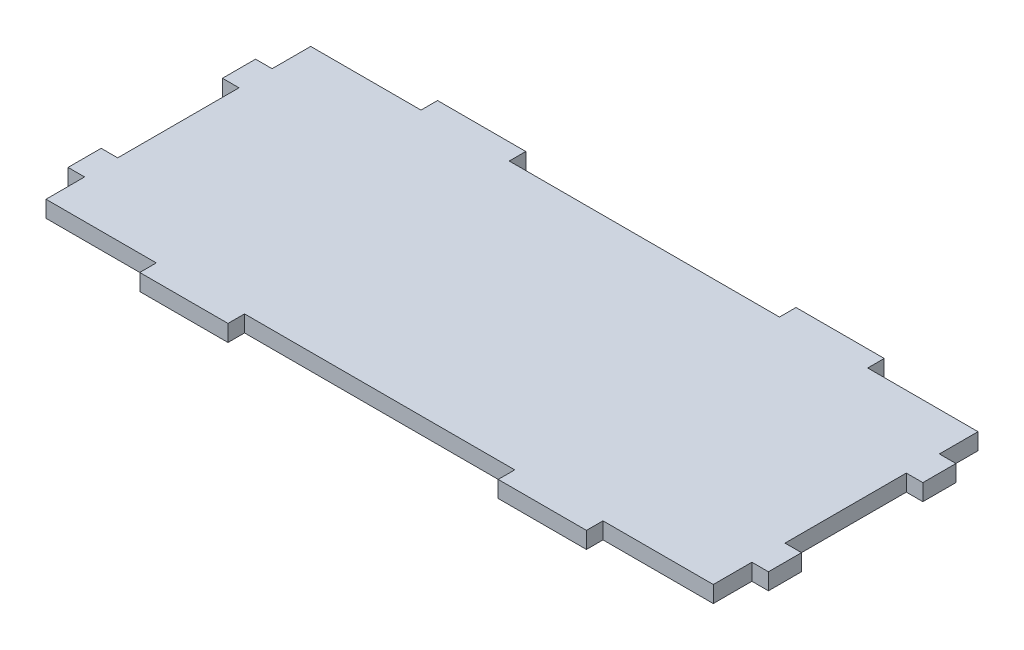
ISO-10303-21;
HEADER;
FILE_DESCRIPTION(('STEP AP214'),'2;1');
FILE_NAME('part.step','',(''),(''),'','','');
FILE_SCHEMA(('AUTOMOTIVE_DESIGN { 1 0 10303 214 1 1 1 1 }'));
ENDSEC;
DATA;
#1=APPLICATION_CONTEXT('core data for automotive mechanical design processes');
#2=APPLICATION_PROTOCOL_DEFINITION('international standard','automotive_design',2000,#1);
#3=PRODUCT_CONTEXT('',#1,'mechanical');
#4=PRODUCT('Part','Part','',(#3));
#5=PRODUCT_RELATED_PRODUCT_CATEGORY('part','',(#4));
#6=PRODUCT_DEFINITION_FORMATION('','',#4);
#7=PRODUCT_DEFINITION_CONTEXT('part definition',#1,'design');
#8=PRODUCT_DEFINITION('design','',#6,#7);
#9=PRODUCT_DEFINITION_SHAPE('','',#8);
#10=(LENGTH_UNIT() NAMED_UNIT(*) SI_UNIT(.MILLI.,.METRE.));
#11=(NAMED_UNIT(*) PLANE_ANGLE_UNIT() SI_UNIT($,.RADIAN.));
#12=(NAMED_UNIT(*) SI_UNIT($,.STERADIAN.) SOLID_ANGLE_UNIT());
#13=UNCERTAINTY_MEASURE_WITH_UNIT(LENGTH_MEASURE(1.E-05),#10,'distance_accuracy_value','');
#14=(GEOMETRIC_REPRESENTATION_CONTEXT(3) GLOBAL_UNCERTAINTY_ASSIGNED_CONTEXT((#13)) GLOBAL_UNIT_ASSIGNED_CONTEXT((#10,
#11,#12)) REPRESENTATION_CONTEXT('',''));
#15=CARTESIAN_POINT('',(0.,0.,0.));
#16=DIRECTION('',(0.,0.,1.));
#17=DIRECTION('',(1.,0.,0.));
#18=AXIS2_PLACEMENT_3D('',#15,#16,#17);
#19=CARTESIAN_POINT('',(85.,3.,0.));
#20=DIRECTION('',(1.,0.,0.));
#21=DIRECTION('',(0.,0.,-1.));
#22=AXIS2_PLACEMENT_3D('',#19,#20,#21);
#23=PLANE('',#22);
#24=DIRECTION('',(0.,0.,1.));
#25=VECTOR('',#24,1.);
#26=CARTESIAN_POINT('',(85.,0.,0.));
#27=LINE('',#26,#25);
#28=CARTESIAN_POINT('',(85.,0.,0.));
#29=VERTEX_POINT('',#28);
#30=CARTESIAN_POINT('',(85.,0.,3.));
#31=VERTEX_POINT('',#30);
#32=EDGE_CURVE('E465',#29,#31,#27,.T.);
#33=ORIENTED_EDGE('',*,*,#32,.T.);
#34=DIRECTION('',(0.,-1.,0.));
#35=VECTOR('',#34,1.);
#36=CARTESIAN_POINT('',(85.,3.,3.));
#37=LINE('',#36,#35);
#38=CARTESIAN_POINT('',(85.,3.,3.));
#39=VERTEX_POINT('',#38);
#40=EDGE_CURVE('E595',#39,#31,#37,.T.);
#41=ORIENTED_EDGE('',*,*,#40,.F.);
#42=DIRECTION('',(0.,0.,1.));
#43=VECTOR('',#42,1.);
#44=CARTESIAN_POINT('',(85.,3.,0.));
#45=LINE('',#44,#43);
#46=CARTESIAN_POINT('',(85.,3.,0.));
#47=VERTEX_POINT('',#46);
#48=EDGE_CURVE('E812',#47,#39,#45,.T.);
#49=ORIENTED_EDGE('',*,*,#48,.F.);
#50=DIRECTION('',(0.,-1.,0.));
#51=VECTOR('',#50,1.);
#52=CARTESIAN_POINT('',(85.,3.,0.));
#53=LINE('',#52,#51);
#54=EDGE_CURVE('E598',#47,#29,#53,.T.);
#55=ORIENTED_EDGE('',*,*,#54,.T.);
#56=EDGE_LOOP('',(#33,#41,#49,#55));
#57=FACE_BOUND('',#56,.T.);
#58=ADVANCED_FACE('F290',(#57),#23,.F.);
#59=CARTESIAN_POINT('',(0.,3.,3.00000000000001));
#60=DIRECTION('',(0.,0.,1.));
#61=DIRECTION('',(1.,0.,0.));
#62=AXIS2_PLACEMENT_3D('',#59,#60,#61);
#63=PLANE('',#62);
#64=DIRECTION('',(-1.,0.,0.));
#65=VECTOR('',#64,1.);
#66=CARTESIAN_POINT('',(0.,0.,3.00000000000001));
#67=LINE('',#66,#65);
#68=CARTESIAN_POINT('',(101.,0.,3.));
#69=VERTEX_POINT('',#68);
#70=EDGE_CURVE('E470',#69,#31,#67,.T.);
#71=ORIENTED_EDGE('',*,*,#70,.F.);
#72=DIRECTION('',(0.,-1.,0.));
#73=VECTOR('',#72,1.);
#74=CARTESIAN_POINT('',(101.,3.,3.));
#75=LINE('',#74,#73);
#76=CARTESIAN_POINT('',(101.,3.,3.));
#77=VERTEX_POINT('',#76);
#78=EDGE_CURVE('E592',#77,#69,#75,.T.);
#79=ORIENTED_EDGE('',*,*,#78,.F.);
#80=DIRECTION('',(-1.,0.,0.));
#81=VECTOR('',#80,1.);
#82=CARTESIAN_POINT('',(0.,3.,3.00000000000001));
#83=LINE('',#82,#81);
#84=EDGE_CURVE('E816',#77,#39,#83,.T.);
#85=ORIENTED_EDGE('',*,*,#84,.T.);
#86=ORIENTED_EDGE('',*,*,#40,.T.);
#87=EDGE_LOOP('',(#71,#79,#85,#86));
#88=FACE_BOUND('',#87,.T.);
#89=ADVANCED_FACE('F901',(#88),#63,.T.);
#90=CARTESIAN_POINT('',(101.,3.,0.));
#91=DIRECTION('',(1.,0.,0.));
#92=DIRECTION('',(0.,0.,-1.));
#93=AXIS2_PLACEMENT_3D('',#90,#91,#92);
#94=PLANE('',#93);
#95=DIRECTION('',(0.,0.,1.));
#96=VECTOR('',#95,1.);
#97=CARTESIAN_POINT('',(101.,0.,0.));
#98=LINE('',#97,#96);
#99=CARTESIAN_POINT('',(101.,0.,0.));
#100=VERTEX_POINT('',#99);
#101=EDGE_CURVE('E473',#100,#69,#98,.T.);
#102=ORIENTED_EDGE('',*,*,#101,.F.);
#103=DIRECTION('',(0.,-1.,0.));
#104=VECTOR('',#103,1.);
#105=CARTESIAN_POINT('',(101.,3.,0.));
#106=LINE('',#105,#104);
#107=CARTESIAN_POINT('',(101.,3.,0.));
#108=VERTEX_POINT('',#107);
#109=EDGE_CURVE('E589',#108,#100,#106,.T.);
#110=ORIENTED_EDGE('',*,*,#109,.F.);
#111=DIRECTION('',(0.,0.,1.));
#112=VECTOR('',#111,1.);
#113=CARTESIAN_POINT('',(101.,3.,0.));
#114=LINE('',#113,#112);
#115=EDGE_CURVE('E876',#108,#77,#114,.T.);
#116=ORIENTED_EDGE('',*,*,#115,.T.);
#117=ORIENTED_EDGE('',*,*,#78,.T.);
#118=EDGE_LOOP('',(#102,#110,#116,#117));
#119=FACE_BOUND('',#118,.T.);
#120=ADVANCED_FACE('F906',(#119),#94,.T.);
#121=CARTESIAN_POINT('',(0.,3.,0.));
#122=DIRECTION('',(0.,0.,-1.));
#123=DIRECTION('',(-1.,0.,0.));
#124=AXIS2_PLACEMENT_3D('',#121,#122,#123);
#125=PLANE('',#124);
#126=DIRECTION('',(1.,0.,0.));
#127=VECTOR('',#126,1.);
#128=CARTESIAN_POINT('',(0.,0.,0.));
#129=LINE('',#128,#127);
#130=CARTESIAN_POINT('',(121.,0.,0.));
#131=VERTEX_POINT('',#130);
#132=EDGE_CURVE('E476',#100,#131,#129,.T.);
#133=ORIENTED_EDGE('',*,*,#132,.T.);
#134=DIRECTION('',(0.,-1.,0.));
#135=VECTOR('',#134,1.);
#136=CARTESIAN_POINT('',(121.,3.,0.));
#137=LINE('',#136,#135);
#138=CARTESIAN_POINT('',(121.,3.,0.));
#139=VERTEX_POINT('',#138);
#140=EDGE_CURVE('E586',#139,#131,#137,.T.);
#141=ORIENTED_EDGE('',*,*,#140,.F.);
#142=DIRECTION('',(1.,0.,0.));
#143=VECTOR('',#142,1.);
#144=CARTESIAN_POINT('',(0.,3.,0.));
#145=LINE('',#144,#143);
#146=EDGE_CURVE('E879',#108,#139,#145,.T.);
#147=ORIENTED_EDGE('',*,*,#146,.F.);
#148=ORIENTED_EDGE('',*,*,#109,.T.);
#149=EDGE_LOOP('',(#133,#141,#147,#148));
#150=FACE_BOUND('',#149,.T.);
#151=ADVANCED_FACE('F1197',(#150),#125,.F.);
#152=CARTESIAN_POINT('',(121.,3.,0.));
#153=DIRECTION('',(-1.,0.,0.));
#154=DIRECTION('',(0.,0.,1.));
#155=AXIS2_PLACEMENT_3D('',#152,#153,#154);
#156=PLANE('',#155);
#157=DIRECTION('',(0.,0.,-1.));
#158=VECTOR('',#157,1.);
#159=CARTESIAN_POINT('',(121.,0.,0.));
#160=LINE('',#159,#158);
#161=CARTESIAN_POINT('',(121.,0.,-7.00000000000002));
#162=VERTEX_POINT('',#161);
#163=EDGE_CURVE('E479',#131,#162,#160,.T.);
#164=ORIENTED_EDGE('',*,*,#163,.T.);
#165=DIRECTION('',(0.,-1.,0.));
#166=VECTOR('',#165,1.);
#167=CARTESIAN_POINT('',(121.,3.,-7.00000000000002));
#168=LINE('',#167,#166);
#169=CARTESIAN_POINT('',(121.,3.,-7.00000000000002));
#170=VERTEX_POINT('',#169);
#171=EDGE_CURVE('E583',#170,#162,#168,.T.);
#172=ORIENTED_EDGE('',*,*,#171,.F.);
#173=DIRECTION('',(0.,0.,-1.));
#174=VECTOR('',#173,1.);
#175=CARTESIAN_POINT('',(121.,3.,0.));
#176=LINE('',#175,#174);
#177=EDGE_CURVE('E705',#139,#170,#176,.T.);
#178=ORIENTED_EDGE('',*,*,#177,.F.);
#179=ORIENTED_EDGE('',*,*,#140,.T.);
#180=EDGE_LOOP('',(#164,#172,#178,#179));
#181=FACE_BOUND('',#180,.T.);
#182=ADVANCED_FACE('F898',(#181),#156,.F.);
#183=CARTESIAN_POINT('',(0.,3.,-6.99999999999998));
#184=DIRECTION('',(0.,0.,-1.));
#185=DIRECTION('',(-1.,0.,0.));
#186=AXIS2_PLACEMENT_3D('',#183,#184,#185);
#187=PLANE('',#186);
#188=DIRECTION('',(1.,0.,0.));
#189=VECTOR('',#188,1.);
#190=CARTESIAN_POINT('',(0.,0.,-6.99999999999998));
#191=LINE('',#190,#189);
#192=CARTESIAN_POINT('',(124.,0.,-7.00000000000002));
#193=VERTEX_POINT('',#192);
#194=EDGE_CURVE('E482',#162,#193,#191,.T.);
#195=ORIENTED_EDGE('',*,*,#194,.T.);
#196=DIRECTION('',(0.,-1.,0.));
#197=VECTOR('',#196,1.);
#198=CARTESIAN_POINT('',(124.,3.,-7.00000000000002));
#199=LINE('',#198,#197);
#200=CARTESIAN_POINT('',(124.,3.,-7.00000000000002));
#201=VERTEX_POINT('',#200);
#202=EDGE_CURVE('E580',#201,#193,#199,.T.);
#203=ORIENTED_EDGE('',*,*,#202,.F.);
#204=DIRECTION('',(1.,0.,0.));
#205=VECTOR('',#204,1.);
#206=CARTESIAN_POINT('',(0.,3.,-6.99999999999998));
#207=LINE('',#206,#205);
#208=EDGE_CURVE('E881',#170,#201,#207,.T.);
#209=ORIENTED_EDGE('',*,*,#208,.F.);
#210=ORIENTED_EDGE('',*,*,#171,.T.);
#211=EDGE_LOOP('',(#195,#203,#209,#210));
#212=FACE_BOUND('',#211,.T.);
#213=ADVANCED_FACE('F1178',(#212),#187,.F.);
#214=CARTESIAN_POINT('',(124.,3.,0.));
#215=DIRECTION('',(1.,0.,0.));
#216=DIRECTION('',(0.,0.,-1.));
#217=AXIS2_PLACEMENT_3D('',#214,#215,#216);
#218=PLANE('',#217);
#219=DIRECTION('',(0.,0.,1.));
#220=VECTOR('',#219,1.);
#221=CARTESIAN_POINT('',(124.,0.,0.));
#222=LINE('',#221,#220);
#223=CARTESIAN_POINT('',(124.,0.,-13.));
#224=VERTEX_POINT('',#223);
#225=EDGE_CURVE('E487',#224,#193,#222,.T.);
#226=ORIENTED_EDGE('',*,*,#225,.F.);
#227=DIRECTION('',(0.,-1.,0.));
#228=VECTOR('',#227,1.);
#229=CARTESIAN_POINT('',(124.,3.,-13.));
#230=LINE('',#229,#228);
#231=CARTESIAN_POINT('',(124.,3.,-13.));
#232=VERTEX_POINT('',#231);
#233=EDGE_CURVE('E577',#232,#224,#230,.T.);
#234=ORIENTED_EDGE('',*,*,#233,.F.);
#235=DIRECTION('',(0.,0.,1.));
#236=VECTOR('',#235,1.);
#237=CARTESIAN_POINT('',(124.,3.,0.));
#238=LINE('',#237,#236);
#239=EDGE_CURVE('E883',#232,#201,#238,.T.);
#240=ORIENTED_EDGE('',*,*,#239,.T.);
#241=ORIENTED_EDGE('',*,*,#202,.T.);
#242=EDGE_LOOP('',(#226,#234,#240,#241));
#243=FACE_BOUND('',#242,.T.);
#244=ADVANCED_FACE('F1167',(#243),#218,.T.);
#245=CARTESIAN_POINT('',(0.,3.,-13.));
#246=DIRECTION('',(0.,0.,-1.));
#247=DIRECTION('',(-1.,0.,0.));
#248=AXIS2_PLACEMENT_3D('',#245,#246,#247);
#249=PLANE('',#248);
#250=DIRECTION('',(1.,0.,0.));
#251=VECTOR('',#250,1.);
#252=CARTESIAN_POINT('',(0.,0.,-13.));
#253=LINE('',#252,#251);
#254=CARTESIAN_POINT('',(121.,0.,-13.));
#255=VERTEX_POINT('',#254);
#256=EDGE_CURVE('E490',#255,#224,#253,.T.);
#257=ORIENTED_EDGE('',*,*,#256,.F.);
#258=DIRECTION('',(0.,-1.,0.));
#259=VECTOR('',#258,1.);
#260=CARTESIAN_POINT('',(121.,3.,-13.));
#261=LINE('',#260,#259);
#262=CARTESIAN_POINT('',(121.,3.,-13.));
#263=VERTEX_POINT('',#262);
#264=EDGE_CURVE('E574',#263,#255,#261,.T.);
#265=ORIENTED_EDGE('',*,*,#264,.F.);
#266=DIRECTION('',(1.,0.,0.));
#267=VECTOR('',#266,1.);
#268=CARTESIAN_POINT('',(0.,3.,-13.));
#269=LINE('',#268,#267);
#270=EDGE_CURVE('E886',#263,#232,#269,.T.);
#271=ORIENTED_EDGE('',*,*,#270,.T.);
#272=ORIENTED_EDGE('',*,*,#233,.T.);
#273=EDGE_LOOP('',(#257,#265,#271,#272));
#274=FACE_BOUND('',#273,.T.);
#275=ADVANCED_FACE('F1158',(#274),#249,.T.);
#276=CARTESIAN_POINT('',(121.,0.,-35.));
#277=VERTEX_POINT('',#276);
#278=EDGE_CURVE('E484',#255,#277,#160,.T.);
#279=ORIENTED_EDGE('',*,*,#278,.T.);
#280=DIRECTION('',(0.,-1.,0.));
#281=VECTOR('',#280,1.);
#282=CARTESIAN_POINT('',(121.,3.,-35.));
#283=LINE('',#282,#281);
#284=CARTESIAN_POINT('',(121.,3.,-35.));
#285=VERTEX_POINT('',#284);
#286=EDGE_CURVE('E571',#285,#277,#283,.T.);
#287=ORIENTED_EDGE('',*,*,#286,.F.);
#288=EDGE_CURVE('E704',#263,#285,#176,.T.);
#289=ORIENTED_EDGE('',*,*,#288,.F.);
#290=ORIENTED_EDGE('',*,*,#264,.T.);
#291=EDGE_LOOP('',(#279,#287,#289,#290));
#292=FACE_BOUND('',#291,.T.);
#293=ADVANCED_FACE('F716',(#292),#156,.F.);
#294=CARTESIAN_POINT('',(0.,3.,-35.));
#295=DIRECTION('',(0.,0.,-1.));
#296=DIRECTION('',(-1.,0.,0.));
#297=AXIS2_PLACEMENT_3D('',#294,#295,#296);
#298=PLANE('',#297);
#299=DIRECTION('',(1.,0.,0.));
#300=VECTOR('',#299,1.);
#301=CARTESIAN_POINT('',(0.,0.,-35.));
#302=LINE('',#301,#300);
#303=CARTESIAN_POINT('',(124.,0.,-35.));
#304=VERTEX_POINT('',#303);
#305=EDGE_CURVE('E493',#277,#304,#302,.T.);
#306=ORIENTED_EDGE('',*,*,#305,.T.);
#307=DIRECTION('',(0.,-1.,0.));
#308=VECTOR('',#307,1.);
#309=CARTESIAN_POINT('',(124.,3.,-35.));
#310=LINE('',#309,#308);
#311=CARTESIAN_POINT('',(124.,3.,-35.));
#312=VERTEX_POINT('',#311);
#313=EDGE_CURVE('E568',#312,#304,#310,.T.);
#314=ORIENTED_EDGE('',*,*,#313,.F.);
#315=DIRECTION('',(1.,0.,0.));
#316=VECTOR('',#315,1.);
#317=CARTESIAN_POINT('',(0.,3.,-35.));
#318=LINE('',#317,#316);
#319=EDGE_CURVE('E730',#285,#312,#318,.T.);
#320=ORIENTED_EDGE('',*,*,#319,.F.);
#321=ORIENTED_EDGE('',*,*,#286,.T.);
#322=EDGE_LOOP('',(#306,#314,#320,#321));
#323=FACE_BOUND('',#322,.T.);
#324=ADVANCED_FACE('F727',(#323),#298,.F.);
#325=CARTESIAN_POINT('',(124.,3.,0.));
#326=DIRECTION('',(1.,0.,0.));
#327=DIRECTION('',(0.,0.,-1.));
#328=AXIS2_PLACEMENT_3D('',#325,#326,#327);
#329=PLANE('',#328);
#330=DIRECTION('',(0.,0.,1.));
#331=VECTOR('',#330,1.);
#332=CARTESIAN_POINT('',(124.,0.,0.));
#333=LINE('',#332,#331);
#334=CARTESIAN_POINT('',(124.,0.,-41.));
#335=VERTEX_POINT('',#334);
#336=EDGE_CURVE('E496',#335,#304,#333,.T.);
#337=ORIENTED_EDGE('',*,*,#336,.F.);
#338=DIRECTION('',(0.,-1.,0.));
#339=VECTOR('',#338,1.);
#340=CARTESIAN_POINT('',(124.,3.,-41.));
#341=LINE('',#340,#339);
#342=CARTESIAN_POINT('',(124.,3.,-41.));
#343=VERTEX_POINT('',#342);
#344=EDGE_CURVE('E565',#343,#335,#341,.T.);
#345=ORIENTED_EDGE('',*,*,#344,.F.);
#346=DIRECTION('',(0.,0.,1.));
#347=VECTOR('',#346,1.);
#348=CARTESIAN_POINT('',(124.,3.,0.));
#349=LINE('',#348,#347);
#350=EDGE_CURVE('E889',#343,#312,#349,.T.);
#351=ORIENTED_EDGE('',*,*,#350,.T.);
#352=ORIENTED_EDGE('',*,*,#313,.T.);
#353=EDGE_LOOP('',(#337,#345,#351,#352));
#354=FACE_BOUND('',#353,.T.);
#355=ADVANCED_FACE('F736',(#354),#329,.T.);
#356=CARTESIAN_POINT('',(0.,3.,-41.));
#357=DIRECTION('',(0.,0.,-1.));
#358=DIRECTION('',(-1.,0.,0.));
#359=AXIS2_PLACEMENT_3D('',#356,#357,#358);
#360=PLANE('',#359);
#361=DIRECTION('',(1.,0.,0.));
#362=VECTOR('',#361,1.);
#363=CARTESIAN_POINT('',(0.,0.,-41.));
#364=LINE('',#363,#362);
#365=CARTESIAN_POINT('',(121.,0.,-41.));
#366=VERTEX_POINT('',#365);
#367=EDGE_CURVE('E499',#366,#335,#364,.T.);
#368=ORIENTED_EDGE('',*,*,#367,.F.);
#369=DIRECTION('',(0.,-1.,0.));
#370=VECTOR('',#369,1.);
#371=CARTESIAN_POINT('',(121.,3.,-41.));
#372=LINE('',#371,#370);
#373=CARTESIAN_POINT('',(121.,3.,-41.));
#374=VERTEX_POINT('',#373);
#375=EDGE_CURVE('E562',#374,#366,#372,.T.);
#376=ORIENTED_EDGE('',*,*,#375,.F.);
#377=DIRECTION('',(1.,0.,0.));
#378=VECTOR('',#377,1.);
#379=CARTESIAN_POINT('',(0.,3.,-41.));
#380=LINE('',#379,#378);
#381=EDGE_CURVE('E436',#374,#343,#380,.T.);
#382=ORIENTED_EDGE('',*,*,#381,.T.);
#383=ORIENTED_EDGE('',*,*,#344,.T.);
#384=EDGE_LOOP('',(#368,#376,#382,#383));
#385=FACE_BOUND('',#384,.T.);
#386=ADVANCED_FACE('F890',(#385),#360,.T.);
#387=CARTESIAN_POINT('',(121.,0.,-48.));
#388=VERTEX_POINT('',#387);
#389=EDGE_CURVE('E483',#366,#388,#160,.T.);
#390=ORIENTED_EDGE('',*,*,#389,.T.);
#391=DIRECTION('',(0.,-1.,0.));
#392=VECTOR('',#391,1.);
#393=CARTESIAN_POINT('',(121.,3.,-48.));
#394=LINE('',#393,#392);
#395=CARTESIAN_POINT('',(121.,3.,-48.));
#396=VERTEX_POINT('',#395);
#397=EDGE_CURVE('E559',#396,#388,#394,.T.);
#398=ORIENTED_EDGE('',*,*,#397,.F.);
#399=EDGE_CURVE('E433',#374,#396,#176,.T.);
#400=ORIENTED_EDGE('',*,*,#399,.F.);
#401=ORIENTED_EDGE('',*,*,#375,.T.);
#402=EDGE_LOOP('',(#390,#398,#400,#401));
#403=FACE_BOUND('',#402,.T.);
#404=ADVANCED_FACE('F707',(#403),#156,.F.);
#405=CARTESIAN_POINT('',(0.,3.,-48.));
#406=DIRECTION('',(0.,0.,-1.));
#407=DIRECTION('',(-1.,0.,0.));
#408=AXIS2_PLACEMENT_3D('',#405,#406,#407);
#409=PLANE('',#408);
#410=DIRECTION('',(0.,-1.,0.));
#411=VECTOR('',#410,1.);
#412=CARTESIAN_POINT('',(101.,3.,-48.));
#413=LINE('',#412,#411);
#414=CARTESIAN_POINT('',(101.,3.,-48.));
#415=VERTEX_POINT('',#414);
#416=CARTESIAN_POINT('',(101.,0.,-48.));
#417=VERTEX_POINT('',#416);
#418=EDGE_CURVE('E294',#415,#417,#413,.T.);
#419=ORIENTED_EDGE('',*,*,#418,.F.);
#420=DIRECTION('',(1.,0.,0.));
#421=VECTOR('',#420,1.);
#422=CARTESIAN_POINT('',(0.,3.,-48.));
#423=LINE('',#422,#421);
#424=EDGE_CURVE('E428',#415,#396,#423,.T.);
#425=ORIENTED_EDGE('',*,*,#424,.T.);
#426=ORIENTED_EDGE('',*,*,#397,.T.);
#427=DIRECTION('',(1.,0.,0.));
#428=VECTOR('',#427,1.);
#429=CARTESIAN_POINT('',(0.,0.,-48.));
#430=LINE('',#429,#428);
#431=EDGE_CURVE('E506',#417,#388,#430,.T.);
#432=ORIENTED_EDGE('',*,*,#431,.F.);
#433=EDGE_LOOP('',(#419,#425,#426,#432));
#434=FACE_BOUND('',#433,.T.);
#435=ADVANCED_FACE('F691',(#434),#409,.T.);
#436=DIRECTION('',(0.,-1.,0.));
#437=VECTOR('',#436,1.);
#438=CARTESIAN_POINT('',(36.,3.,-48.));
#439=LINE('',#438,#437);
#440=CARTESIAN_POINT('',(36.,3.,-48.));
#441=VERTEX_POINT('',#440);
#442=CARTESIAN_POINT('',(36.,0.,-48.));
#443=VERTEX_POINT('',#442);
#444=EDGE_CURVE('E12',#441,#443,#439,.T.);
#445=ORIENTED_EDGE('',*,*,#444,.F.);
#446=CARTESIAN_POINT('',(85.,3.,-48.));
#447=VERTEX_POINT('',#446);
#448=EDGE_CURVE('E420',#441,#447,#423,.T.);
#449=ORIENTED_EDGE('',*,*,#448,.T.);
#450=DIRECTION('',(0.,-1.,0.));
#451=VECTOR('',#450,1.);
#452=CARTESIAN_POINT('',(85.,3.,-48.));
#453=LINE('',#452,#451);
#454=CARTESIAN_POINT('',(85.,0.,-48.));
#455=VERTEX_POINT('',#454);
#456=EDGE_CURVE('E385',#447,#455,#453,.T.);
#457=ORIENTED_EDGE('',*,*,#456,.T.);
#458=EDGE_CURVE('E376',#443,#455,#430,.T.);
#459=ORIENTED_EDGE('',*,*,#458,.F.);
#460=EDGE_LOOP('',(#445,#449,#457,#459));
#461=FACE_BOUND('',#460,.T.);
#462=ADVANCED_FACE('F425',(#461),#409,.T.);
#463=CARTESIAN_POINT('',(0.,3.,-48.));
#464=VERTEX_POINT('',#463);
#465=CARTESIAN_POINT('',(20.,3.,-48.));
#466=VERTEX_POINT('',#465);
#467=EDGE_CURVE('E427',#464,#466,#423,.T.);
#468=ORIENTED_EDGE('',*,*,#467,.T.);
#469=DIRECTION('',(0.,-1.,0.));
#470=VECTOR('',#469,1.);
#471=CARTESIAN_POINT('',(20.,3.,-48.));
#472=LINE('',#471,#470);
#473=CARTESIAN_POINT('',(20.,0.,-48.));
#474=VERTEX_POINT('',#473);
#475=EDGE_CURVE('E300',#466,#474,#472,.T.);
#476=ORIENTED_EDGE('',*,*,#475,.T.);
#477=CARTESIAN_POINT('',(0.,0.,-48.));
#478=VERTEX_POINT('',#477);
#479=EDGE_CURVE('E502',#478,#474,#430,.T.);
#480=ORIENTED_EDGE('',*,*,#479,.F.);
#481=DIRECTION('',(0.,-1.,0.));
#482=VECTOR('',#481,1.);
#483=CARTESIAN_POINT('',(0.,3.,-48.));
#484=LINE('',#483,#482);
#485=EDGE_CURVE('E556',#464,#478,#484,.T.);
#486=ORIENTED_EDGE('',*,*,#485,.F.);
#487=EDGE_LOOP('',(#468,#476,#480,#486));
#488=FACE_BOUND('',#487,.T.);
#489=ADVANCED_FACE('F641',(#488),#409,.T.);
#490=CARTESIAN_POINT('',(0.,3.,0.));
#491=DIRECTION('',(-1.,0.,0.));
#492=DIRECTION('',(0.,0.,1.));
#493=AXIS2_PLACEMENT_3D('',#490,#491,#492);
#494=PLANE('',#493);
#495=DIRECTION('',(0.,-1.,0.));
#496=VECTOR('',#495,1.);
#497=CARTESIAN_POINT('',(0.,3.,-41.));
#498=LINE('',#497,#496);
#499=CARTESIAN_POINT('',(0.,3.,-41.));
#500=VERTEX_POINT('',#499);
#501=CARTESIAN_POINT('',(0.,0.,-41.));
#502=VERTEX_POINT('',#501);
#503=EDGE_CURVE('E309',#500,#502,#498,.T.);
#504=ORIENTED_EDGE('',*,*,#503,.F.);
#505=DIRECTION('',(0.,0.,-1.));
#506=VECTOR('',#505,1.);
#507=CARTESIAN_POINT('',(0.,3.,0.));
#508=LINE('',#507,#506);
#509=EDGE_CURVE('E431',#500,#464,#508,.T.);
#510=ORIENTED_EDGE('',*,*,#509,.T.);
#511=ORIENTED_EDGE('',*,*,#485,.T.);
#512=DIRECTION('',(0.,0.,-1.));
#513=VECTOR('',#512,1.);
#514=CARTESIAN_POINT('',(0.,0.,0.));
#515=LINE('',#514,#513);
#516=EDGE_CURVE('E505',#502,#478,#515,.T.);
#517=ORIENTED_EDGE('',*,*,#516,.F.);
#518=EDGE_LOOP('',(#504,#510,#511,#517));
#519=FACE_BOUND('',#518,.T.);
#520=ADVANCED_FACE('F648',(#519),#494,.T.);
#521=CARTESIAN_POINT('',(0.,3.,-13.));
#522=VERTEX_POINT('',#521);
#523=CARTESIAN_POINT('',(0.,3.,-35.));
#524=VERTEX_POINT('',#523);
#525=EDGE_CURVE('E438',#522,#524,#508,.T.);
#526=ORIENTED_EDGE('',*,*,#525,.T.);
#527=DIRECTION('',(0.,-1.,0.));
#528=VECTOR('',#527,1.);
#529=CARTESIAN_POINT('',(0.,3.,-35.));
#530=LINE('',#529,#528);
#531=CARTESIAN_POINT('',(0.,0.,-35.));
#532=VERTEX_POINT('',#531);
#533=EDGE_CURVE('E601',#524,#532,#530,.T.);
#534=ORIENTED_EDGE('',*,*,#533,.T.);
#535=CARTESIAN_POINT('',(0.,0.,-13.));
#536=VERTEX_POINT('',#535);
#537=EDGE_CURVE('E507',#536,#532,#515,.T.);
#538=ORIENTED_EDGE('',*,*,#537,.F.);
#539=DIRECTION('',(0.,-1.,0.));
#540=VECTOR('',#539,1.);
#541=CARTESIAN_POINT('',(0.,3.,-13.));
#542=LINE('',#541,#540);
#543=EDGE_CURVE('E553',#522,#536,#542,.T.);
#544=ORIENTED_EDGE('',*,*,#543,.F.);
#545=EDGE_LOOP('',(#526,#534,#538,#544));
#546=FACE_BOUND('',#545,.T.);
#547=ADVANCED_FACE('F861',(#546),#494,.T.);
#548=CARTESIAN_POINT('',(0.,3.,-13.));
#549=DIRECTION('',(0.,0.,1.));
#550=DIRECTION('',(1.,0.,0.));
#551=AXIS2_PLACEMENT_3D('',#548,#549,#550);
#552=PLANE('',#551);
#553=DIRECTION('',(-1.,0.,0.));
#554=VECTOR('',#553,1.);
#555=CARTESIAN_POINT('',(0.,0.,-13.));
#556=LINE('',#555,#554);
#557=CARTESIAN_POINT('',(-3.,0.,-13.));
#558=VERTEX_POINT('',#557);
#559=EDGE_CURVE('E510',#536,#558,#556,.T.);
#560=ORIENTED_EDGE('',*,*,#559,.T.);
#561=DIRECTION('',(0.,-1.,0.));
#562=VECTOR('',#561,1.);
#563=CARTESIAN_POINT('',(-3.,3.,-13.));
#564=LINE('',#563,#562);
#565=CARTESIAN_POINT('',(-3.,3.,-13.));
#566=VERTEX_POINT('',#565);
#567=EDGE_CURVE('E550',#566,#558,#564,.T.);
#568=ORIENTED_EDGE('',*,*,#567,.F.);
#569=DIRECTION('',(-1.,0.,0.));
#570=VECTOR('',#569,1.);
#571=CARTESIAN_POINT('',(0.,3.,-13.));
#572=LINE('',#571,#570);
#573=EDGE_CURVE('E441',#522,#566,#572,.T.);
#574=ORIENTED_EDGE('',*,*,#573,.F.);
#575=ORIENTED_EDGE('',*,*,#543,.T.);
#576=EDGE_LOOP('',(#560,#568,#574,#575));
#577=FACE_BOUND('',#576,.T.);
#578=ADVANCED_FACE('F1069',(#577),#552,.F.);
#579=CARTESIAN_POINT('',(-3.,3.,0.));
#580=DIRECTION('',(1.,0.,0.));
#581=DIRECTION('',(0.,0.,-1.));
#582=AXIS2_PLACEMENT_3D('',#579,#580,#581);
#583=PLANE('',#582);
#584=DIRECTION('',(0.,0.,1.));
#585=VECTOR('',#584,1.);
#586=CARTESIAN_POINT('',(-3.,0.,0.));
#587=LINE('',#586,#585);
#588=CARTESIAN_POINT('',(-3.,0.,-7.));
#589=VERTEX_POINT('',#588);
#590=EDGE_CURVE('E514',#558,#589,#587,.T.);
#591=ORIENTED_EDGE('',*,*,#590,.T.);
#592=DIRECTION('',(0.,-1.,0.));
#593=VECTOR('',#592,1.);
#594=CARTESIAN_POINT('',(-3.,3.,-7.));
#595=LINE('',#594,#593);
#596=CARTESIAN_POINT('',(-3.,3.,-7.));
#597=VERTEX_POINT('',#596);
#598=EDGE_CURVE('E547',#597,#589,#595,.T.);
#599=ORIENTED_EDGE('',*,*,#598,.F.);
#600=DIRECTION('',(0.,0.,1.));
#601=VECTOR('',#600,1.);
#602=CARTESIAN_POINT('',(-3.,3.,0.));
#603=LINE('',#602,#601);
#604=EDGE_CURVE('E445',#566,#597,#603,.T.);
#605=ORIENTED_EDGE('',*,*,#604,.F.);
#606=ORIENTED_EDGE('',*,*,#567,.T.);
#607=EDGE_LOOP('',(#591,#599,#605,#606));
#608=FACE_BOUND('',#607,.T.);
#609=ADVANCED_FACE('F855',(#608),#583,.F.);
#610=CARTESIAN_POINT('',(0.,3.,-7.));
#611=DIRECTION('',(0.,0.,1.));
#612=DIRECTION('',(1.,0.,0.));
#613=AXIS2_PLACEMENT_3D('',#610,#611,#612);
#614=PLANE('',#613);
#615=DIRECTION('',(-1.,0.,0.));
#616=VECTOR('',#615,1.);
#617=CARTESIAN_POINT('',(0.,0.,-7.));
#618=LINE('',#617,#616);
#619=CARTESIAN_POINT('',(0.,0.,-7.));
#620=VERTEX_POINT('',#619);
#621=EDGE_CURVE('E517',#620,#589,#618,.T.);
#622=ORIENTED_EDGE('',*,*,#621,.F.);
#623=DIRECTION('',(0.,-1.,0.));
#624=VECTOR('',#623,1.);
#625=CARTESIAN_POINT('',(0.,3.,-7.));
#626=LINE('',#625,#624);
#627=CARTESIAN_POINT('',(0.,3.,-7.));
#628=VERTEX_POINT('',#627);
#629=EDGE_CURVE('E544',#628,#620,#626,.T.);
#630=ORIENTED_EDGE('',*,*,#629,.F.);
#631=DIRECTION('',(-1.,0.,0.));
#632=VECTOR('',#631,1.);
#633=CARTESIAN_POINT('',(0.,3.,-7.));
#634=LINE('',#633,#632);
#635=EDGE_CURVE('E448',#628,#597,#634,.T.);
#636=ORIENTED_EDGE('',*,*,#635,.T.);
#637=ORIENTED_EDGE('',*,*,#598,.T.);
#638=EDGE_LOOP('',(#622,#630,#636,#637));
#639=FACE_BOUND('',#638,.T.);
#640=ADVANCED_FACE('F851',(#639),#614,.T.);
#641=CARTESIAN_POINT('',(0.,0.,0.));
#642=VERTEX_POINT('',#641);
#643=EDGE_CURVE('E511',#642,#620,#515,.T.);
#644=ORIENTED_EDGE('',*,*,#643,.F.);
#645=DIRECTION('',(0.,-1.,0.));
#646=VECTOR('',#645,1.);
#647=CARTESIAN_POINT('',(0.,3.,0.));
#648=LINE('',#647,#646);
#649=CARTESIAN_POINT('',(0.,3.,0.));
#650=VERTEX_POINT('',#649);
#651=EDGE_CURVE('E541',#650,#642,#648,.T.);
#652=ORIENTED_EDGE('',*,*,#651,.F.);
#653=EDGE_CURVE('E442',#650,#628,#508,.T.);
#654=ORIENTED_EDGE('',*,*,#653,.T.);
#655=ORIENTED_EDGE('',*,*,#629,.T.);
#656=EDGE_LOOP('',(#644,#652,#654,#655));
#657=FACE_BOUND('',#656,.T.);
#658=ADVANCED_FACE('F847',(#657),#494,.T.);
#659=CARTESIAN_POINT('',(0.,3.,0.));
#660=DIRECTION('',(0.,0.,-1.));
#661=DIRECTION('',(-1.,0.,0.));
#662=AXIS2_PLACEMENT_3D('',#659,#660,#661);
#663=PLANE('',#662);
#664=DIRECTION('',(1.,0.,0.));
#665=VECTOR('',#664,1.);
#666=CARTESIAN_POINT('',(0.,0.,0.));
#667=LINE('',#666,#665);
#668=CARTESIAN_POINT('',(20.,0.,0.));
#669=VERTEX_POINT('',#668);
#670=EDGE_CURVE('E467',#642,#669,#667,.T.);
#671=ORIENTED_EDGE('',*,*,#670,.T.);
#672=DIRECTION('',(0.,-1.,0.));
#673=VECTOR('',#672,1.);
#674=CARTESIAN_POINT('',(20.,3.,0.));
#675=LINE('',#674,#673);
#676=CARTESIAN_POINT('',(20.,3.,0.));
#677=VERTEX_POINT('',#676);
#678=EDGE_CURVE('E538',#677,#669,#675,.T.);
#679=ORIENTED_EDGE('',*,*,#678,.F.);
#680=DIRECTION('',(1.,0.,0.));
#681=VECTOR('',#680,1.);
#682=CARTESIAN_POINT('',(0.,3.,0.));
#683=LINE('',#682,#681);
#684=EDGE_CURVE('E455',#650,#677,#683,.T.);
#685=ORIENTED_EDGE('',*,*,#684,.F.);
#686=ORIENTED_EDGE('',*,*,#651,.T.);
#687=EDGE_LOOP('',(#671,#679,#685,#686));
#688=FACE_BOUND('',#687,.T.);
#689=ADVANCED_FACE('F842',(#688),#663,.F.);
#690=CARTESIAN_POINT('',(20.,3.,0.));
#691=DIRECTION('',(1.,0.,0.));
#692=DIRECTION('',(0.,0.,-1.));
#693=AXIS2_PLACEMENT_3D('',#690,#691,#692);
#694=PLANE('',#693);
#695=DIRECTION('',(0.,0.,1.));
#696=VECTOR('',#695,1.);
#697=CARTESIAN_POINT('',(20.,0.,0.));
#698=LINE('',#697,#696);
#699=CARTESIAN_POINT('',(20.,0.,3.));
#700=VERTEX_POINT('',#699);
#701=EDGE_CURVE('E520',#669,#700,#698,.T.);
#702=ORIENTED_EDGE('',*,*,#701,.T.);
#703=DIRECTION('',(0.,-1.,0.));
#704=VECTOR('',#703,1.);
#705=CARTESIAN_POINT('',(20.,3.,3.));
#706=LINE('',#705,#704);
#707=CARTESIAN_POINT('',(20.,3.,3.));
#708=VERTEX_POINT('',#707);
#709=EDGE_CURVE('E535',#708,#700,#706,.T.);
#710=ORIENTED_EDGE('',*,*,#709,.F.);
#711=DIRECTION('',(0.,0.,1.));
#712=VECTOR('',#711,1.);
#713=CARTESIAN_POINT('',(20.,3.,0.));
#714=LINE('',#713,#712);
#715=EDGE_CURVE('E451',#677,#708,#714,.T.);
#716=ORIENTED_EDGE('',*,*,#715,.F.);
#717=ORIENTED_EDGE('',*,*,#678,.T.);
#718=EDGE_LOOP('',(#702,#710,#716,#717));
#719=FACE_BOUND('',#718,.T.);
#720=ADVANCED_FACE('F837',(#719),#694,.F.);
#721=CARTESIAN_POINT('',(0.,3.,3.));
#722=DIRECTION('',(0.,0.,-1.));
#723=DIRECTION('',(-1.,0.,0.));
#724=AXIS2_PLACEMENT_3D('',#721,#722,#723);
#725=PLANE('',#724);
#726=DIRECTION('',(1.,0.,0.));
#727=VECTOR('',#726,1.);
#728=CARTESIAN_POINT('',(0.,0.,3.));
#729=LINE('',#728,#727);
#730=CARTESIAN_POINT('',(36.,0.,3.));
#731=VERTEX_POINT('',#730);
#732=EDGE_CURVE('E523',#700,#731,#729,.T.);
#733=ORIENTED_EDGE('',*,*,#732,.T.);
#734=DIRECTION('',(0.,-1.,0.));
#735=VECTOR('',#734,1.);
#736=CARTESIAN_POINT('',(36.,3.,3.));
#737=LINE('',#736,#735);
#738=CARTESIAN_POINT('',(36.,3.,3.));
#739=VERTEX_POINT('',#738);
#740=EDGE_CURVE('E532',#739,#731,#737,.T.);
#741=ORIENTED_EDGE('',*,*,#740,.F.);
#742=DIRECTION('',(1.,0.,0.));
#743=VECTOR('',#742,1.);
#744=CARTESIAN_POINT('',(0.,3.,3.));
#745=LINE('',#744,#743);
#746=EDGE_CURVE('E454',#708,#739,#745,.T.);
#747=ORIENTED_EDGE('',*,*,#746,.F.);
#748=ORIENTED_EDGE('',*,*,#709,.T.);
#749=EDGE_LOOP('',(#733,#741,#747,#748));
#750=FACE_BOUND('',#749,.T.);
#751=ADVANCED_FACE('F830',(#750),#725,.F.);
#752=CARTESIAN_POINT('',(36.,3.,0.));
#753=DIRECTION('',(1.,0.,0.));
#754=DIRECTION('',(0.,0.,-1.));
#755=AXIS2_PLACEMENT_3D('',#752,#753,#754);
#756=PLANE('',#755);
#757=DIRECTION('',(0.,0.,1.));
#758=VECTOR('',#757,1.);
#759=CARTESIAN_POINT('',(36.,0.,0.));
#760=LINE('',#759,#758);
#761=CARTESIAN_POINT('',(36.,0.,0.));
#762=VERTEX_POINT('',#761);
#763=EDGE_CURVE('E526',#762,#731,#760,.T.);
#764=ORIENTED_EDGE('',*,*,#763,.F.);
#765=DIRECTION('',(0.,-1.,0.));
#766=VECTOR('',#765,1.);
#767=CARTESIAN_POINT('',(36.,3.,0.));
#768=LINE('',#767,#766);
#769=CARTESIAN_POINT('',(36.,3.,0.));
#770=VERTEX_POINT('',#769);
#771=EDGE_CURVE('E461',#770,#762,#768,.T.);
#772=ORIENTED_EDGE('',*,*,#771,.F.);
#773=DIRECTION('',(0.,0.,1.));
#774=VECTOR('',#773,1.);
#775=CARTESIAN_POINT('',(36.,3.,0.));
#776=LINE('',#775,#774);
#777=EDGE_CURVE('E458',#770,#739,#776,.T.);
#778=ORIENTED_EDGE('',*,*,#777,.T.);
#779=ORIENTED_EDGE('',*,*,#740,.T.);
#780=EDGE_LOOP('',(#764,#772,#778,#779));
#781=FACE_BOUND('',#780,.T.);
#782=ADVANCED_FACE('F826',(#781),#756,.T.);
#783=EDGE_CURVE('E462',#762,#29,#667,.T.);
#784=ORIENTED_EDGE('',*,*,#783,.T.);
#785=ORIENTED_EDGE('',*,*,#54,.F.);
#786=EDGE_CURVE('E529',#770,#47,#683,.T.);
#787=ORIENTED_EDGE('',*,*,#786,.F.);
#788=ORIENTED_EDGE('',*,*,#771,.T.);
#789=EDGE_LOOP('',(#784,#785,#787,#788));
#790=FACE_BOUND('',#789,.T.);
#791=ADVANCED_FACE('F822',(#790),#663,.F.);
#792=CARTESIAN_POINT('',(0.,0.,0.));
#793=DIRECTION('',(0.,1.,0.));
#794=DIRECTION('',(0.,0.,1.));
#795=AXIS2_PLACEMENT_3D('',#792,#793,#794);
#796=PLANE('',#795);
#797=ORIENTED_EDGE('',*,*,#783,.F.);
#798=ORIENTED_EDGE('',*,*,#763,.T.);
#799=ORIENTED_EDGE('',*,*,#732,.F.);
#800=ORIENTED_EDGE('',*,*,#701,.F.);
#801=ORIENTED_EDGE('',*,*,#670,.F.);
#802=ORIENTED_EDGE('',*,*,#643,.T.);
#803=ORIENTED_EDGE('',*,*,#621,.T.);
#804=ORIENTED_EDGE('',*,*,#590,.F.);
#805=ORIENTED_EDGE('',*,*,#559,.F.);
#806=ORIENTED_EDGE('',*,*,#537,.T.);
#807=DIRECTION('',(-1.,0.,0.));
#808=VECTOR('',#807,1.);
#809=CARTESIAN_POINT('',(0.,0.,-35.));
#810=LINE('',#809,#808);
#811=CARTESIAN_POINT('',(-3.,0.,-35.));
#812=VERTEX_POINT('',#811);
#813=EDGE_CURVE('E606',#532,#812,#810,.T.);
#814=ORIENTED_EDGE('',*,*,#813,.T.);
#815=DIRECTION('',(0.,0.,1.));
#816=VECTOR('',#815,1.);
#817=CARTESIAN_POINT('',(-3.,0.,-41.));
#818=LINE('',#817,#816);
#819=CARTESIAN_POINT('',(-3.,0.,-41.));
#820=VERTEX_POINT('',#819);
#821=EDGE_CURVE('E614',#820,#812,#818,.T.);
#822=ORIENTED_EDGE('',*,*,#821,.F.);
#823=DIRECTION('',(-1.,0.,0.));
#824=VECTOR('',#823,1.);
#825=CARTESIAN_POINT('',(0.,0.,-41.));
#826=LINE('',#825,#824);
#827=EDGE_CURVE('E407',#502,#820,#826,.T.);
#828=ORIENTED_EDGE('',*,*,#827,.F.);
#829=ORIENTED_EDGE('',*,*,#516,.T.);
#830=ORIENTED_EDGE('',*,*,#479,.T.);
#831=DIRECTION('',(0.,0.,1.));
#832=VECTOR('',#831,1.);
#833=CARTESIAN_POINT('',(20.,0.,-51.));
#834=LINE('',#833,#832);
#835=CARTESIAN_POINT('',(20.,0.,-51.));
#836=VERTEX_POINT('',#835);
#837=EDGE_CURVE('E393',#836,#474,#834,.T.);
#838=ORIENTED_EDGE('',*,*,#837,.F.);
#839=DIRECTION('',(1.,0.,0.));
#840=VECTOR('',#839,1.);
#841=CARTESIAN_POINT('',(20.,0.,-51.));
#842=LINE('',#841,#840);
#843=CARTESIAN_POINT('',(36.,0.,-51.));
#844=VERTEX_POINT('',#843);
#845=EDGE_CURVE('E388',#836,#844,#842,.T.);
#846=ORIENTED_EDGE('',*,*,#845,.T.);
#847=DIRECTION('',(0.,0.,1.));
#848=VECTOR('',#847,1.);
#849=CARTESIAN_POINT('',(36.,0.,-51.));
#850=LINE('',#849,#848);
#851=EDGE_CURVE('E387',#844,#443,#850,.T.);
#852=ORIENTED_EDGE('',*,*,#851,.T.);
#853=ORIENTED_EDGE('',*,*,#458,.T.);
#854=DIRECTION('',(0.,0.,1.));
#855=VECTOR('',#854,1.);
#856=CARTESIAN_POINT('',(85.,0.,-51.));
#857=LINE('',#856,#855);
#858=CARTESIAN_POINT('',(85.,0.,-51.));
#859=VERTEX_POINT('',#858);
#860=EDGE_CURVE('E362',#859,#455,#857,.T.);
#861=ORIENTED_EDGE('',*,*,#860,.F.);
#862=DIRECTION('',(1.,0.,0.));
#863=VECTOR('',#862,1.);
#864=CARTESIAN_POINT('',(85.,0.,-51.));
#865=LINE('',#864,#863);
#866=CARTESIAN_POINT('',(101.,0.,-51.));
#867=VERTEX_POINT('',#866);
#868=EDGE_CURVE('E373',#859,#867,#865,.T.);
#869=ORIENTED_EDGE('',*,*,#868,.T.);
#870=DIRECTION('',(0.,0.,1.));
#871=VECTOR('',#870,1.);
#872=CARTESIAN_POINT('',(101.,0.,-51.));
#873=LINE('',#872,#871);
#874=EDGE_CURVE('E380',#867,#417,#873,.T.);
#875=ORIENTED_EDGE('',*,*,#874,.T.);
#876=ORIENTED_EDGE('',*,*,#431,.T.);
#877=ORIENTED_EDGE('',*,*,#389,.F.);
#878=ORIENTED_EDGE('',*,*,#367,.T.);
#879=ORIENTED_EDGE('',*,*,#336,.T.);
#880=ORIENTED_EDGE('',*,*,#305,.F.);
#881=ORIENTED_EDGE('',*,*,#278,.F.);
#882=ORIENTED_EDGE('',*,*,#256,.T.);
#883=ORIENTED_EDGE('',*,*,#225,.T.);
#884=ORIENTED_EDGE('',*,*,#194,.F.);
#885=ORIENTED_EDGE('',*,*,#163,.F.);
#886=ORIENTED_EDGE('',*,*,#132,.F.);
#887=ORIENTED_EDGE('',*,*,#101,.T.);
#888=ORIENTED_EDGE('',*,*,#70,.T.);
#889=ORIENTED_EDGE('',*,*,#32,.F.);
#890=EDGE_LOOP('',(#797,#798,#799,#800,#801,#802,#803,#804,#805,#806,#814,#822,#828,#829,#830,
#838,#846,#852,#853,#861,#869,#875,#876,#877,#878,#879,#880,#881,#882,#883,#884,#885,#886,#887,
#888,#889));
#891=FACE_BOUND('',#890,.T.);
#892=ADVANCED_FACE('F371',(#891),#796,.F.);
#893=CARTESIAN_POINT('',(0.,3.,0.));
#894=DIRECTION('',(0.,1.,0.));
#895=DIRECTION('',(0.,0.,1.));
#896=AXIS2_PLACEMENT_3D('',#893,#894,#895);
#897=PLANE('',#896);
#898=ORIENTED_EDGE('',*,*,#786,.T.);
#899=ORIENTED_EDGE('',*,*,#48,.T.);
#900=ORIENTED_EDGE('',*,*,#84,.F.);
#901=ORIENTED_EDGE('',*,*,#115,.F.);
#902=ORIENTED_EDGE('',*,*,#146,.T.);
#903=ORIENTED_EDGE('',*,*,#177,.T.);
#904=ORIENTED_EDGE('',*,*,#208,.T.);
#905=ORIENTED_EDGE('',*,*,#239,.F.);
#906=ORIENTED_EDGE('',*,*,#270,.F.);
#907=ORIENTED_EDGE('',*,*,#288,.T.);
#908=ORIENTED_EDGE('',*,*,#319,.T.);
#909=ORIENTED_EDGE('',*,*,#350,.F.);
#910=ORIENTED_EDGE('',*,*,#381,.F.);
#911=ORIENTED_EDGE('',*,*,#399,.T.);
#912=ORIENTED_EDGE('',*,*,#424,.F.);
#913=DIRECTION('',(0.,0.,1.));
#914=VECTOR('',#913,1.);
#915=CARTESIAN_POINT('',(101.,3.,-51.));
#916=LINE('',#915,#914);
#917=CARTESIAN_POINT('',(101.,3.,-51.));
#918=VERTEX_POINT('',#917);
#919=EDGE_CURVE('E377',#918,#415,#916,.T.);
#920=ORIENTED_EDGE('',*,*,#919,.F.);
#921=DIRECTION('',(1.,0.,0.));
#922=VECTOR('',#921,1.);
#923=CARTESIAN_POINT('',(85.,3.,-51.));
#924=LINE('',#923,#922);
#925=CARTESIAN_POINT('',(85.,3.,-51.));
#926=VERTEX_POINT('',#925);
#927=EDGE_CURVE('E411',#926,#918,#924,.T.);
#928=ORIENTED_EDGE('',*,*,#927,.F.);
#929=DIRECTION('',(0.,0.,1.));
#930=VECTOR('',#929,1.);
#931=CARTESIAN_POINT('',(85.,3.,-51.));
#932=LINE('',#931,#930);
#933=EDGE_CURVE('E365',#926,#447,#932,.T.);
#934=ORIENTED_EDGE('',*,*,#933,.T.);
#935=ORIENTED_EDGE('',*,*,#448,.F.);
#936=DIRECTION('',(0.,0.,1.));
#937=VECTOR('',#936,1.);
#938=CARTESIAN_POINT('',(36.,3.,-51.));
#939=LINE('',#938,#937);
#940=CARTESIAN_POINT('',(36.,3.,-51.));
#941=VERTEX_POINT('',#940);
#942=EDGE_CURVE('E401',#941,#441,#939,.T.);
#943=ORIENTED_EDGE('',*,*,#942,.F.);
#944=DIRECTION('',(1.,0.,0.));
#945=VECTOR('',#944,1.);
#946=CARTESIAN_POINT('',(20.,3.,-51.));
#947=LINE('',#946,#945);
#948=CARTESIAN_POINT('',(20.,3.,-51.));
#949=VERTEX_POINT('',#948);
#950=EDGE_CURVE('E625',#949,#941,#947,.T.);
#951=ORIENTED_EDGE('',*,*,#950,.F.);
#952=DIRECTION('',(0.,0.,1.));
#953=VECTOR('',#952,1.);
#954=CARTESIAN_POINT('',(20.,3.,-51.));
#955=LINE('',#954,#953);
#956=EDGE_CURVE('E396',#949,#466,#955,.T.);
#957=ORIENTED_EDGE('',*,*,#956,.T.);
#958=ORIENTED_EDGE('',*,*,#467,.F.);
#959=ORIENTED_EDGE('',*,*,#509,.F.);
#960=DIRECTION('',(-1.,0.,0.));
#961=VECTOR('',#960,1.);
#962=CARTESIAN_POINT('',(0.,3.,-41.));
#963=LINE('',#962,#961);
#964=CARTESIAN_POINT('',(-3.,3.,-41.));
#965=VERTEX_POINT('',#964);
#966=EDGE_CURVE('E602',#500,#965,#963,.T.);
#967=ORIENTED_EDGE('',*,*,#966,.T.);
#968=DIRECTION('',(0.,0.,1.));
#969=VECTOR('',#968,1.);
#970=CARTESIAN_POINT('',(-3.,3.,-41.));
#971=LINE('',#970,#969);
#972=CARTESIAN_POINT('',(-3.,3.,-35.));
#973=VERTEX_POINT('',#972);
#974=EDGE_CURVE('E605',#965,#973,#971,.T.);
#975=ORIENTED_EDGE('',*,*,#974,.T.);
#976=DIRECTION('',(-1.,0.,0.));
#977=VECTOR('',#976,1.);
#978=CARTESIAN_POINT('',(0.,3.,-35.));
#979=LINE('',#978,#977);
#980=EDGE_CURVE('E608',#524,#973,#979,.T.);
#981=ORIENTED_EDGE('',*,*,#980,.F.);
#982=ORIENTED_EDGE('',*,*,#525,.F.);
#983=ORIENTED_EDGE('',*,*,#573,.T.);
#984=ORIENTED_EDGE('',*,*,#604,.T.);
#985=ORIENTED_EDGE('',*,*,#635,.F.);
#986=ORIENTED_EDGE('',*,*,#653,.F.);
#987=ORIENTED_EDGE('',*,*,#684,.T.);
#988=ORIENTED_EDGE('',*,*,#715,.T.);
#989=ORIENTED_EDGE('',*,*,#746,.T.);
#990=ORIENTED_EDGE('',*,*,#777,.F.);
#991=EDGE_LOOP('',(#898,#899,#900,#901,#902,#903,#904,#905,#906,#907,#908,#909,#910,#911,#912,
#920,#928,#934,#935,#943,#951,#957,#958,#959,#967,#975,#981,#982,#983,#984,#985,#986,#987,#988,
#989,#990));
#992=FACE_BOUND('',#991,.T.);
#993=ADVANCED_FACE('F417',(#992),#897,.T.);
#994=CARTESIAN_POINT('',(-3.,3.,-41.));
#995=DIRECTION('',(1.,0.,0.));
#996=DIRECTION('',(0.,0.,-1.));
#997=AXIS2_PLACEMENT_3D('',#994,#995,#996);
#998=PLANE('',#997);
#999=ORIENTED_EDGE('',*,*,#821,.T.);
#1000=DIRECTION('',(0.,-1.,0.));
#1001=VECTOR('',#1000,1.);
#1002=CARTESIAN_POINT('',(-3.,3.,-35.));
#1003=LINE('',#1002,#1001);
#1004=EDGE_CURVE('E611',#973,#812,#1003,.T.);
#1005=ORIENTED_EDGE('',*,*,#1004,.F.);
#1006=ORIENTED_EDGE('',*,*,#974,.F.);
#1007=DIRECTION('',(0.,-1.,0.));
#1008=VECTOR('',#1007,1.);
#1009=CARTESIAN_POINT('',(-3.,3.,-41.));
#1010=LINE('',#1009,#1008);
#1011=EDGE_CURVE('E466',#965,#820,#1010,.T.);
#1012=ORIENTED_EDGE('',*,*,#1011,.T.);
#1013=EDGE_LOOP('',(#999,#1005,#1006,#1012));
#1014=FACE_BOUND('',#1013,.T.);
#1015=ADVANCED_FACE('F871',(#1014),#998,.F.);
#1016=CARTESIAN_POINT('',(0.,3.,-35.));
#1017=DIRECTION('',(0.,0.,1.));
#1018=DIRECTION('',(1.,0.,0.));
#1019=AXIS2_PLACEMENT_3D('',#1016,#1017,#1018);
#1020=PLANE('',#1019);
#1021=ORIENTED_EDGE('',*,*,#813,.F.);
#1022=ORIENTED_EDGE('',*,*,#533,.F.);
#1023=ORIENTED_EDGE('',*,*,#980,.T.);
#1024=ORIENTED_EDGE('',*,*,#1004,.T.);
#1025=EDGE_LOOP('',(#1021,#1022,#1023,#1024));
#1026=FACE_BOUND('',#1025,.T.);
#1027=ADVANCED_FACE('F867',(#1026),#1020,.T.);
#1028=CARTESIAN_POINT('',(0.,3.,-41.));
#1029=DIRECTION('',(0.,0.,1.));
#1030=DIRECTION('',(1.,0.,0.));
#1031=AXIS2_PLACEMENT_3D('',#1028,#1029,#1030);
#1032=PLANE('',#1031);
#1033=ORIENTED_EDGE('',*,*,#827,.T.);
#1034=ORIENTED_EDGE('',*,*,#1011,.F.);
#1035=ORIENTED_EDGE('',*,*,#966,.F.);
#1036=ORIENTED_EDGE('',*,*,#503,.T.);
#1037=EDGE_LOOP('',(#1033,#1034,#1035,#1036));
#1038=FACE_BOUND('',#1037,.T.);
#1039=ADVANCED_FACE('F873',(#1038),#1032,.F.);
#1040=CARTESIAN_POINT('',(85.,3.,-51.));
#1041=DIRECTION('',(0.,0.,-1.));
#1042=DIRECTION('',(-1.,0.,0.));
#1043=AXIS2_PLACEMENT_3D('',#1040,#1041,#1042);
#1044=PLANE('',#1043);
#1045=ORIENTED_EDGE('',*,*,#868,.F.);
#1046=DIRECTION('',(0.,-1.,0.));
#1047=VECTOR('',#1046,1.);
#1048=CARTESIAN_POINT('',(85.,3.,-51.));
#1049=LINE('',#1048,#1047);
#1050=EDGE_CURVE('E357',#926,#859,#1049,.T.);
#1051=ORIENTED_EDGE('',*,*,#1050,.F.);
#1052=ORIENTED_EDGE('',*,*,#927,.T.);
#1053=DIRECTION('',(0.,-1.,0.));
#1054=VECTOR('',#1053,1.);
#1055=CARTESIAN_POINT('',(101.,3.,-51.));
#1056=LINE('',#1055,#1054);
#1057=EDGE_CURVE('E351',#918,#867,#1056,.T.);
#1058=ORIENTED_EDGE('',*,*,#1057,.T.);
#1059=EDGE_LOOP('',(#1045,#1051,#1052,#1058));
#1060=FACE_BOUND('',#1059,.T.);
#1061=ADVANCED_FACE('F379',(#1060),#1044,.T.);
#1062=CARTESIAN_POINT('',(85.,3.,-51.));
#1063=DIRECTION('',(1.,0.,0.));
#1064=DIRECTION('',(0.,0.,-1.));
#1065=AXIS2_PLACEMENT_3D('',#1062,#1063,#1064);
#1066=PLANE('',#1065);
#1067=ORIENTED_EDGE('',*,*,#860,.T.);
#1068=ORIENTED_EDGE('',*,*,#456,.F.);
#1069=ORIENTED_EDGE('',*,*,#933,.F.);
#1070=ORIENTED_EDGE('',*,*,#1050,.T.);
#1071=EDGE_LOOP('',(#1067,#1068,#1069,#1070));
#1072=FACE_BOUND('',#1071,.T.);
#1073=ADVANCED_FACE('F359',(#1072),#1066,.F.);
#1074=CARTESIAN_POINT('',(101.,3.,-51.));
#1075=DIRECTION('',(1.,0.,0.));
#1076=DIRECTION('',(0.,0.,-1.));
#1077=AXIS2_PLACEMENT_3D('',#1074,#1075,#1076);
#1078=PLANE('',#1077);
#1079=ORIENTED_EDGE('',*,*,#874,.F.);
#1080=ORIENTED_EDGE('',*,*,#1057,.F.);
#1081=ORIENTED_EDGE('',*,*,#919,.T.);
#1082=ORIENTED_EDGE('',*,*,#418,.T.);
#1083=EDGE_LOOP('',(#1079,#1080,#1081,#1082));
#1084=FACE_BOUND('',#1083,.T.);
#1085=ADVANCED_FACE('F292',(#1084),#1078,.T.);
#1086=CARTESIAN_POINT('',(20.,3.,-51.));
#1087=DIRECTION('',(0.,0.,-1.));
#1088=DIRECTION('',(-1.,0.,0.));
#1089=AXIS2_PLACEMENT_3D('',#1086,#1087,#1088);
#1090=PLANE('',#1089);
#1091=ORIENTED_EDGE('',*,*,#845,.F.);
#1092=DIRECTION('',(0.,-1.,0.));
#1093=VECTOR('',#1092,1.);
#1094=CARTESIAN_POINT('',(20.,3.,-51.));
#1095=LINE('',#1094,#1093);
#1096=EDGE_CURVE('E404',#949,#836,#1095,.T.);
#1097=ORIENTED_EDGE('',*,*,#1096,.F.);
#1098=ORIENTED_EDGE('',*,*,#950,.T.);
#1099=DIRECTION('',(0.,-1.,0.));
#1100=VECTOR('',#1099,1.);
#1101=CARTESIAN_POINT('',(36.,3.,-51.));
#1102=LINE('',#1101,#1100);
#1103=EDGE_CURVE('E406',#941,#844,#1102,.T.);
#1104=ORIENTED_EDGE('',*,*,#1103,.T.);
#1105=EDGE_LOOP('',(#1091,#1097,#1098,#1104));
#1106=FACE_BOUND('',#1105,.T.);
#1107=ADVANCED_FACE('F921',(#1106),#1090,.T.);
#1108=CARTESIAN_POINT('',(20.,3.,-51.));
#1109=DIRECTION('',(1.,0.,0.));
#1110=DIRECTION('',(0.,0.,-1.));
#1111=AXIS2_PLACEMENT_3D('',#1108,#1109,#1110);
#1112=PLANE('',#1111);
#1113=ORIENTED_EDGE('',*,*,#837,.T.);
#1114=ORIENTED_EDGE('',*,*,#475,.F.);
#1115=ORIENTED_EDGE('',*,*,#956,.F.);
#1116=ORIENTED_EDGE('',*,*,#1096,.T.);
#1117=EDGE_LOOP('',(#1113,#1114,#1115,#1116));
#1118=FACE_BOUND('',#1117,.T.);
#1119=ADVANCED_FACE('F917',(#1118),#1112,.F.);
#1120=CARTESIAN_POINT('',(36.,3.,-51.));
#1121=DIRECTION('',(1.,0.,0.));
#1122=DIRECTION('',(0.,0.,-1.));
#1123=AXIS2_PLACEMENT_3D('',#1120,#1121,#1122);
#1124=PLANE('',#1123);
#1125=ORIENTED_EDGE('',*,*,#851,.F.);
#1126=ORIENTED_EDGE('',*,*,#1103,.F.);
#1127=ORIENTED_EDGE('',*,*,#942,.T.);
#1128=ORIENTED_EDGE('',*,*,#444,.T.);
#1129=EDGE_LOOP('',(#1125,#1126,#1127,#1128));
#1130=FACE_BOUND('',#1129,.T.);
#1131=ADVANCED_FACE('F920',(#1130),#1124,.T.);
#1132=CLOSED_SHELL('',(#58,#89,#120,#151,#182,#213,#244,#275,#293,#324,#355,#386,#404,#435,#462,
#489,#520,#547,#578,#609,#640,#658,#689,#720,#751,#782,#791,#892,#993,#1015,#1027,#1039,#1061,
#1073,#1085,#1107,#1119,#1131));
#1133=MANIFOLD_SOLID_BREP('B2',#1132);
#1134=ADVANCED_BREP_SHAPE_REPRESENTATION('',(#18,#1133),#14);
#1135=SHAPE_DEFINITION_REPRESENTATION(#9,#1134);
ENDSEC;
END-ISO-10303-21;
